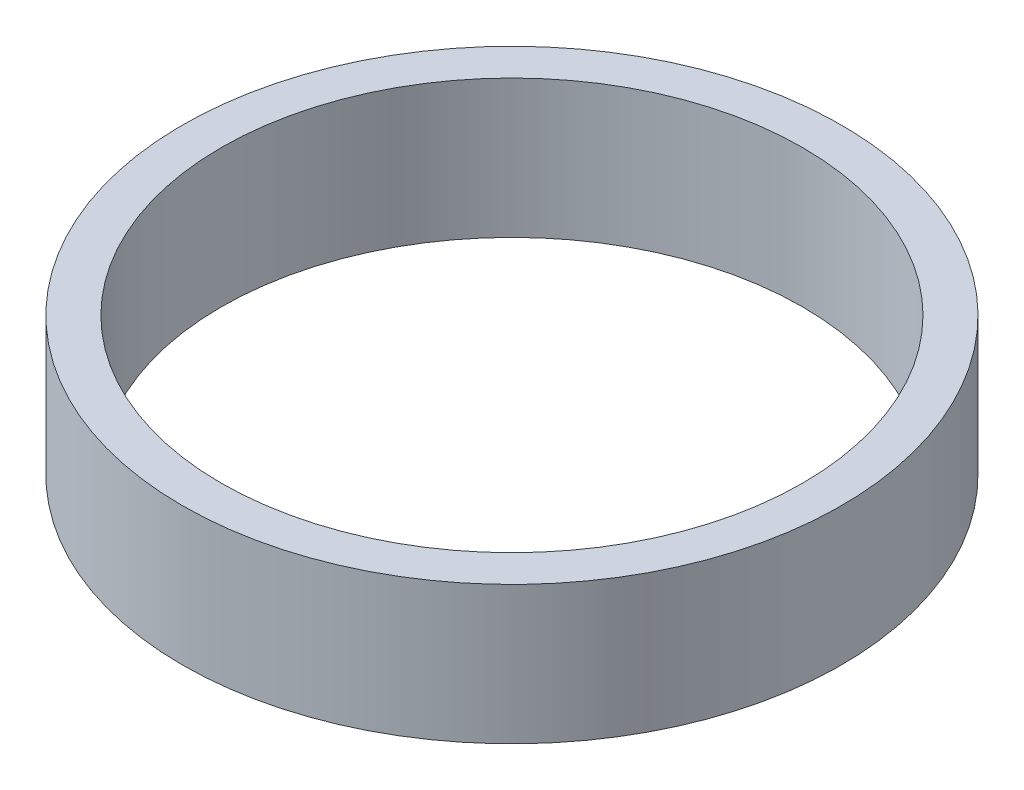
ISO-10303-21;
HEADER;
FILE_DESCRIPTION(('STEP AP214'),'2;1');
FILE_NAME('part.step','',(''),(''),'','','');
FILE_SCHEMA(('AUTOMOTIVE_DESIGN { 1 0 10303 214 1 1 1 1 }'));
ENDSEC;
DATA;
#1=APPLICATION_CONTEXT('core data for automotive mechanical design processes');
#2=APPLICATION_PROTOCOL_DEFINITION('international standard','automotive_design',2000,#1);
#3=PRODUCT_CONTEXT('',#1,'mechanical');
#4=PRODUCT('Part','Part','',(#3));
#5=PRODUCT_RELATED_PRODUCT_CATEGORY('part','',(#4));
#6=PRODUCT_DEFINITION_FORMATION('','',#4);
#7=PRODUCT_DEFINITION_CONTEXT('part definition',#1,'design');
#8=PRODUCT_DEFINITION('design','',#6,#7);
#9=PRODUCT_DEFINITION_SHAPE('','',#8);
#10=(LENGTH_UNIT() NAMED_UNIT(*) SI_UNIT(.MILLI.,.METRE.));
#11=(NAMED_UNIT(*) PLANE_ANGLE_UNIT() SI_UNIT($,.RADIAN.));
#12=(NAMED_UNIT(*) SI_UNIT($,.STERADIAN.) SOLID_ANGLE_UNIT());
#13=UNCERTAINTY_MEASURE_WITH_UNIT(LENGTH_MEASURE(1.E-05),#10,'distance_accuracy_value','');
#14=(GEOMETRIC_REPRESENTATION_CONTEXT(3) GLOBAL_UNCERTAINTY_ASSIGNED_CONTEXT((#13)) GLOBAL_UNIT_ASSIGNED_CONTEXT((#10,
#11,#12)) REPRESENTATION_CONTEXT('',''));
#15=CARTESIAN_POINT('',(0.,0.,0.));
#16=DIRECTION('',(0.,0.,1.));
#17=DIRECTION('',(1.,0.,0.));
#18=AXIS2_PLACEMENT_3D('',#15,#16,#17);
#19=CARTESIAN_POINT('',(0.,4.191,0.));
#20=DIRECTION('',(0.,1.,0.));
#21=DIRECTION('',(0.,0.,1.));
#22=AXIS2_PLACEMENT_3D('',#19,#20,#21);
#23=PLANE('',#22);
#24=CARTESIAN_POINT('',(0.,4.191,0.));
#25=DIRECTION('',(0.,1.,0.));
#26=DIRECTION('',(0.,0.,1.));
#27=AXIS2_PLACEMENT_3D('',#24,#25,#26);
#28=CIRCLE('',#27,10.0076);
#29=CARTESIAN_POINT('',(0.,4.191,10.0076));
#30=VERTEX_POINT('',#29);
#31=EDGE_CURVE('E10',#30,#30,#28,.T.);
#32=ORIENTED_EDGE('',*,*,#31,.T.);
#33=EDGE_LOOP('',(#32));
#34=FACE_BOUND('',#33,.T.);
#35=CARTESIAN_POINT('',(0.,4.191,0.));
#36=DIRECTION('',(0.,1.,0.));
#37=DIRECTION('',(0.,0.,1.));
#38=AXIS2_PLACEMENT_3D('',#35,#36,#37);
#39=CIRCLE('',#38,8.8265);
#40=CARTESIAN_POINT('',(0.,4.191,8.8265));
#41=VERTEX_POINT('',#40);
#42=EDGE_CURVE('E42',#41,#41,#39,.T.);
#43=ORIENTED_EDGE('',*,*,#42,.F.);
#44=EDGE_LOOP('',(#43));
#45=FACE_BOUND('',#44,.T.);
#46=ADVANCED_FACE('F31',(#34,#45),#23,.T.);
#47=CARTESIAN_POINT('',(0.,0.,0.));
#48=DIRECTION('',(0.,1.,0.));
#49=DIRECTION('',(0.,0.,1.));
#50=AXIS2_PLACEMENT_3D('',#47,#48,#49);
#51=PLANE('',#50);
#52=CARTESIAN_POINT('',(0.,0.,0.));
#53=DIRECTION('',(0.,1.,0.));
#54=DIRECTION('',(0.,0.,1.));
#55=AXIS2_PLACEMENT_3D('',#52,#53,#54);
#56=CIRCLE('',#55,10.0076);
#57=CARTESIAN_POINT('',(0.,0.,10.0076));
#58=VERTEX_POINT('',#57);
#59=EDGE_CURVE('E35',#58,#58,#56,.T.);
#60=ORIENTED_EDGE('',*,*,#59,.F.);
#61=EDGE_LOOP('',(#60));
#62=FACE_BOUND('',#61,.T.);
#63=CARTESIAN_POINT('',(0.,0.,0.));
#64=DIRECTION('',(0.,1.,0.));
#65=DIRECTION('',(0.,0.,1.));
#66=AXIS2_PLACEMENT_3D('',#63,#64,#65);
#67=CIRCLE('',#66,8.8265);
#68=CARTESIAN_POINT('',(0.,0.,8.8265));
#69=VERTEX_POINT('',#68);
#70=EDGE_CURVE('E44',#69,#69,#67,.T.);
#71=ORIENTED_EDGE('',*,*,#70,.T.);
#72=EDGE_LOOP('',(#71));
#73=FACE_BOUND('',#72,.T.);
#74=ADVANCED_FACE('F54',(#62,#73),#51,.F.);
#75=CARTESIAN_POINT('',(0.,4.191,0.));
#76=DIRECTION('',(0.,-1.,0.));
#77=DIRECTION('',(0.,0.,-1.));
#78=AXIS2_PLACEMENT_3D('',#75,#76,#77);
#79=CYLINDRICAL_SURFACE('',#78,10.0076);
#80=ORIENTED_EDGE('',*,*,#31,.F.);
#81=EDGE_LOOP('',(#80));
#82=FACE_BOUND('',#81,.T.);
#83=ORIENTED_EDGE('',*,*,#59,.T.);
#84=EDGE_LOOP('',(#83));
#85=FACE_BOUND('',#84,.T.);
#86=ADVANCED_FACE('F33',(#82,#85),#79,.T.);
#87=CARTESIAN_POINT('',(0.,4.191,0.));
#88=DIRECTION('',(0.,-1.,0.));
#89=DIRECTION('',(0.,0.,-1.));
#90=AXIS2_PLACEMENT_3D('',#87,#88,#89);
#91=CYLINDRICAL_SURFACE('',#90,8.8265);
#92=ORIENTED_EDGE('',*,*,#42,.T.);
#93=EDGE_LOOP('',(#92));
#94=FACE_BOUND('',#93,.T.);
#95=ORIENTED_EDGE('',*,*,#70,.F.);
#96=EDGE_LOOP('',(#95));
#97=FACE_BOUND('',#96,.T.);
#98=ADVANCED_FACE('F50',(#94,#97),#91,.F.);
#99=CLOSED_SHELL('',(#46,#74,#86,#98));
#100=MANIFOLD_SOLID_BREP('B2',#99);
#101=ADVANCED_BREP_SHAPE_REPRESENTATION('',(#18,#100),#14);
#102=SHAPE_DEFINITION_REPRESENTATION(#9,#101);
ENDSEC;
END-ISO-10303-21;
